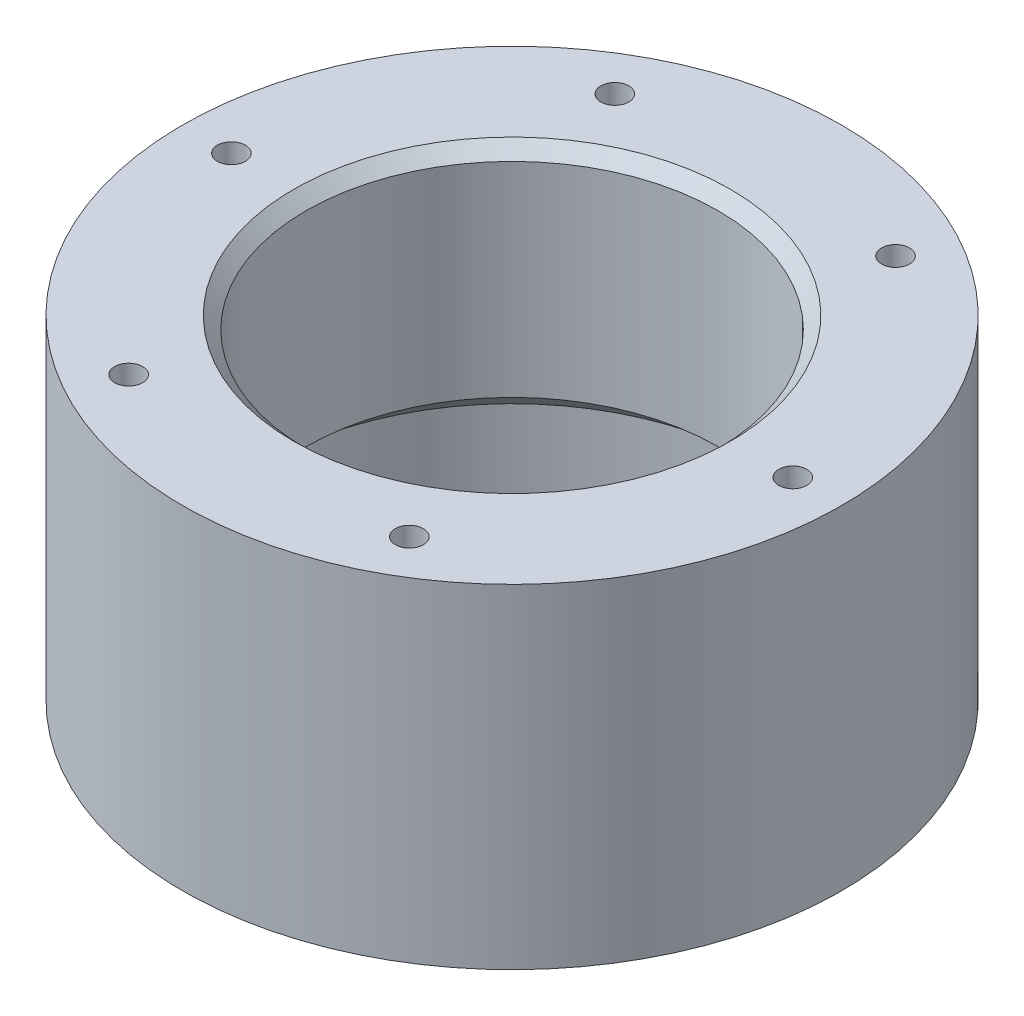
ISO-10303-21;
HEADER;
FILE_DESCRIPTION(('STEP AP214'),'2;1');
FILE_NAME('part.step','',(''),(''),'','','');
FILE_SCHEMA(('AUTOMOTIVE_DESIGN { 1 0 10303 214 1 1 1 1 }'));
ENDSEC;
DATA;
#1=APPLICATION_CONTEXT('core data for automotive mechanical design processes');
#2=APPLICATION_PROTOCOL_DEFINITION('international standard','automotive_design',2000,#1);
#3=PRODUCT_CONTEXT('',#1,'mechanical');
#4=PRODUCT('Part','Part','',(#3));
#5=PRODUCT_RELATED_PRODUCT_CATEGORY('part','',(#4));
#6=PRODUCT_DEFINITION_FORMATION('','',#4);
#7=PRODUCT_DEFINITION_CONTEXT('part definition',#1,'design');
#8=PRODUCT_DEFINITION('design','',#6,#7);
#9=PRODUCT_DEFINITION_SHAPE('','',#8);
#10=(LENGTH_UNIT() NAMED_UNIT(*) SI_UNIT(.MILLI.,.METRE.));
#11=(NAMED_UNIT(*) PLANE_ANGLE_UNIT() SI_UNIT($,.RADIAN.));
#12=(NAMED_UNIT(*) SI_UNIT($,.STERADIAN.) SOLID_ANGLE_UNIT());
#13=UNCERTAINTY_MEASURE_WITH_UNIT(LENGTH_MEASURE(1.E-05),#10,'distance_accuracy_value','');
#14=(GEOMETRIC_REPRESENTATION_CONTEXT(3) GLOBAL_UNCERTAINTY_ASSIGNED_CONTEXT((#13)) GLOBAL_UNIT_ASSIGNED_CONTEXT((#10,
#11,#12)) REPRESENTATION_CONTEXT('',''));
#15=CARTESIAN_POINT('',(0.,0.,0.));
#16=DIRECTION('',(0.,0.,1.));
#17=DIRECTION('',(1.,0.,0.));
#18=AXIS2_PLACEMENT_3D('',#15,#16,#17);
#19=CARTESIAN_POINT('',(0.,0.,0.));
#20=DIRECTION('',(0.,-1.,0.));
#21=DIRECTION('',(0.,0.,-1.));
#22=AXIS2_PLACEMENT_3D('',#19,#20,#21);
#23=CYLINDRICAL_SURFACE('',#22,60.);
#24=CARTESIAN_POINT('',(0.,-4.52770419426052,0.));
#25=DIRECTION('',(0.,-1.,0.));
#26=DIRECTION('',(0.,0.,-1.));
#27=AXIS2_PLACEMENT_3D('',#24,#25,#26);
#28=CIRCLE('',#27,60.);
#29=CARTESIAN_POINT('',(0.,-4.52770419426052,-60.));
#30=VERTEX_POINT('',#29);
#31=EDGE_CURVE('E107',#30,#30,#28,.T.);
#32=ORIENTED_EDGE('',*,*,#31,.T.);
#33=EDGE_LOOP('',(#32));
#34=FACE_BOUND('',#33,.T.);
#35=CARTESIAN_POINT('',(0.,15.4722958057395,0.));
#36=DIRECTION('',(0.,-1.,0.));
#37=DIRECTION('',(0.,0.,-1.));
#38=AXIS2_PLACEMENT_3D('',#35,#36,#37);
#39=CIRCLE('',#38,60.);
#40=CARTESIAN_POINT('',(0.,15.4722958057395,-60.));
#41=VERTEX_POINT('',#40);
#42=EDGE_CURVE('E11',#41,#41,#39,.T.);
#43=ORIENTED_EDGE('',*,*,#42,.F.);
#44=EDGE_LOOP('',(#43));
#45=FACE_BOUND('',#44,.T.);
#46=ADVANCED_FACE('F36',(#34,#45),#23,.F.);
#47=CARTESIAN_POINT('',(0.,15.4722958057395,0.));
#48=DIRECTION('',(0.,-1.,0.));
#49=DIRECTION('',(0.,0.,-1.));
#50=AXIS2_PLACEMENT_3D('',#47,#48,#49);
#51=CONICAL_SURFACE('',#50,60.,0.872664625997163);
#52=CARTESIAN_POINT('',(0.,23.8632921175124,0.));
#53=DIRECTION('',(0.,-1.,0.));
#54=DIRECTION('',(0.,0.,-1.));
#55=AXIS2_PLACEMENT_3D('',#52,#53,#54);
#56=CIRCLE('',#55,50.);
#57=CARTESIAN_POINT('',(0.,23.8632921175124,-50.));
#58=VERTEX_POINT('',#57);
#59=EDGE_CURVE('E43',#58,#58,#56,.T.);
#60=ORIENTED_EDGE('',*,*,#59,.F.);
#61=EDGE_LOOP('',(#60));
#62=FACE_BOUND('',#61,.T.);
#63=ORIENTED_EDGE('',*,*,#42,.T.);
#64=EDGE_LOOP('',(#63));
#65=FACE_BOUND('',#64,.T.);
#66=ADVANCED_FACE('F127',(#62,#65),#51,.F.);
#67=CARTESIAN_POINT('',(0.,0.,0.));
#68=DIRECTION('',(0.,-1.,0.));
#69=DIRECTION('',(0.,0.,-1.));
#70=AXIS2_PLACEMENT_3D('',#67,#68,#69);
#71=CYLINDRICAL_SURFACE('',#70,50.);
#72=ORIENTED_EDGE('',*,*,#59,.T.);
#73=EDGE_LOOP('',(#72));
#74=FACE_BOUND('',#73,.T.);
#75=CARTESIAN_POINT('',(0.,73.4722958057395,0.));
#76=DIRECTION('',(0.,-1.,0.));
#77=DIRECTION('',(0.,0.,-1.));
#78=AXIS2_PLACEMENT_3D('',#75,#76,#77);
#79=CIRCLE('',#78,50.);
#80=CARTESIAN_POINT('',(0.,73.4722958057395,-50.));
#81=VERTEX_POINT('',#80);
#82=EDGE_CURVE('E119',#81,#81,#79,.T.);
#83=ORIENTED_EDGE('',*,*,#82,.F.);
#84=EDGE_LOOP('',(#83));
#85=FACE_BOUND('',#84,.T.);
#86=ADVANCED_FACE('F124',(#74,#85),#71,.F.);
#87=CARTESIAN_POINT('',(0.,73.4722958057395,0.));
#88=DIRECTION('',(0.,1.,0.));
#89=DIRECTION('',(0.,0.,1.));
#90=AXIS2_PLACEMENT_3D('',#87,#88,#89);
#91=CONICAL_SURFACE('',#90,50.,0.785398163397448);
#92=CARTESIAN_POINT('',(0.,76.4722958057395,0.));
#93=DIRECTION('',(0.,-1.,0.));
#94=DIRECTION('',(0.,0.,-1.));
#95=AXIS2_PLACEMENT_3D('',#92,#93,#94);
#96=CIRCLE('',#95,53.);
#97=CARTESIAN_POINT('',(0.,76.4722958057395,-53.));
#98=VERTEX_POINT('',#97);
#99=EDGE_CURVE('E116',#98,#98,#96,.T.);
#100=ORIENTED_EDGE('',*,*,#99,.F.);
#101=EDGE_LOOP('',(#100));
#102=FACE_BOUND('',#101,.T.);
#103=ORIENTED_EDGE('',*,*,#82,.T.);
#104=EDGE_LOOP('',(#103));
#105=FACE_BOUND('',#104,.T.);
#106=ADVANCED_FACE('F154',(#102,#105),#91,.F.);
#107=CARTESIAN_POINT('',(0.,76.4722958057395,0.));
#108=DIRECTION('',(0.,-1.,0.));
#109=DIRECTION('',(0.,0.,-1.));
#110=AXIS2_PLACEMENT_3D('',#107,#108,#109);
#111=PLANE('',#110);
#112=CARTESIAN_POINT('',(-68.1367283340731,76.4722958057395,4.7579623093648E-13));
#113=DIRECTION('',(0.,1.,0.));
#114=DIRECTION('',(0.,0.,1.));
#115=AXIS2_PLACEMENT_3D('',#112,#113,#114);
#116=CIRCLE('',#115,3.4);
#117=CARTESIAN_POINT('',(-68.1367283340731,76.4722958057395,3.40000000000048));
#118=VERTEX_POINT('',#117);
#119=EDGE_CURVE('E73',#118,#118,#116,.T.);
#120=ORIENTED_EDGE('',*,*,#119,.F.);
#121=EDGE_LOOP('',(#120));
#122=FACE_BOUND('',#121,.T.);
#123=CARTESIAN_POINT('',(-34.0683641670368,76.4722958057395,-59.0081376680661));
#124=DIRECTION('',(0.,1.,0.));
#125=DIRECTION('',(0.,0.,1.));
#126=AXIS2_PLACEMENT_3D('',#123,#124,#125);
#127=CIRCLE('',#126,3.4);
#128=CARTESIAN_POINT('',(-34.0683641670368,76.4722958057395,-55.6081376680661));
#129=VERTEX_POINT('',#128);
#130=EDGE_CURVE('E72',#129,#129,#127,.T.);
#131=ORIENTED_EDGE('',*,*,#130,.F.);
#132=EDGE_LOOP('',(#131));
#133=FACE_BOUND('',#132,.T.);
#134=CARTESIAN_POINT('',(34.0683641670364,76.4722958057395,-59.0081376680663));
#135=DIRECTION('',(0.,1.,0.));
#136=DIRECTION('',(0.,0.,1.));
#137=AXIS2_PLACEMENT_3D('',#134,#135,#136);
#138=CIRCLE('',#137,3.4);
#139=CARTESIAN_POINT('',(34.0683641670364,76.4722958057395,-55.6081376680663));
#140=VERTEX_POINT('',#139);
#141=EDGE_CURVE('E83',#140,#140,#138,.T.);
#142=ORIENTED_EDGE('',*,*,#141,.F.);
#143=EDGE_LOOP('',(#142));
#144=FACE_BOUND('',#143,.T.);
#145=CARTESIAN_POINT('',(68.1367283340731,76.4722958057395,0.));
#146=DIRECTION('',(0.,1.,0.));
#147=DIRECTION('',(0.,0.,1.));
#148=AXIS2_PLACEMENT_3D('',#145,#146,#147);
#149=CIRCLE('',#148,3.4);
#150=CARTESIAN_POINT('',(68.1367283340731,76.4722958057395,3.4));
#151=VERTEX_POINT('',#150);
#152=EDGE_CURVE('E89',#151,#151,#149,.T.);
#153=ORIENTED_EDGE('',*,*,#152,.F.);
#154=EDGE_LOOP('',(#153));
#155=FACE_BOUND('',#154,.T.);
#156=CARTESIAN_POINT('',(34.0683641670372,76.4722958057395,59.0081376680658));
#157=DIRECTION('',(0.,1.,0.));
#158=DIRECTION('',(0.,0.,1.));
#159=AXIS2_PLACEMENT_3D('',#156,#157,#158);
#160=CIRCLE('',#159,3.4);
#161=CARTESIAN_POINT('',(34.0683641670372,76.4722958057395,62.4081376680658));
#162=VERTEX_POINT('',#161);
#163=EDGE_CURVE('E95',#162,#162,#160,.T.);
#164=ORIENTED_EDGE('',*,*,#163,.F.);
#165=EDGE_LOOP('',(#164));
#166=FACE_BOUND('',#165,.T.);
#167=CARTESIAN_POINT('',(-34.068364167036,76.4722958057395,59.0081376680665));
#168=DIRECTION('',(0.,1.,0.));
#169=DIRECTION('',(0.,0.,1.));
#170=AXIS2_PLACEMENT_3D('',#167,#168,#169);
#171=CIRCLE('',#170,3.4);
#172=CARTESIAN_POINT('',(-34.068364167036,76.4722958057395,62.4081376680665));
#173=VERTEX_POINT('',#172);
#174=EDGE_CURVE('E101',#173,#173,#171,.T.);
#175=ORIENTED_EDGE('',*,*,#174,.F.);
#176=EDGE_LOOP('',(#175));
#177=FACE_BOUND('',#176,.T.);
#178=CARTESIAN_POINT('',(0.,76.4722958057395,0.));
#179=DIRECTION('',(0.,-1.,0.));
#180=DIRECTION('',(0.,0.,-1.));
#181=AXIS2_PLACEMENT_3D('',#178,#179,#180);
#182=CIRCLE('',#181,80.);
#183=CARTESIAN_POINT('',(0.,76.4722958057395,-80.));
#184=VERTEX_POINT('',#183);
#185=EDGE_CURVE('E113',#184,#184,#182,.T.);
#186=ORIENTED_EDGE('',*,*,#185,.F.);
#187=EDGE_LOOP('',(#186));
#188=FACE_BOUND('',#187,.T.);
#189=ORIENTED_EDGE('',*,*,#99,.T.);
#190=EDGE_LOOP('',(#189));
#191=FACE_BOUND('',#190,.T.);
#192=ADVANCED_FACE('F148',(#122,#133,#144,#155,#166,#177,#188,#191),#111,.F.);
#193=CARTESIAN_POINT('',(0.,0.,0.));
#194=DIRECTION('',(0.,-1.,0.));
#195=DIRECTION('',(0.,0.,-1.));
#196=AXIS2_PLACEMENT_3D('',#193,#194,#195);
#197=CYLINDRICAL_SURFACE('',#196,80.);
#198=CARTESIAN_POINT('',(0.,-4.52770419426052,0.));
#199=DIRECTION('',(0.,-1.,0.));
#200=DIRECTION('',(0.,0.,-1.));
#201=AXIS2_PLACEMENT_3D('',#198,#199,#200);
#202=CIRCLE('',#201,80.);
#203=CARTESIAN_POINT('',(0.,-4.52770419426052,-80.));
#204=VERTEX_POINT('',#203);
#205=EDGE_CURVE('E110',#204,#204,#202,.T.);
#206=ORIENTED_EDGE('',*,*,#205,.F.);
#207=EDGE_LOOP('',(#206));
#208=FACE_BOUND('',#207,.T.);
#209=ORIENTED_EDGE('',*,*,#185,.T.);
#210=EDGE_LOOP('',(#209));
#211=FACE_BOUND('',#210,.T.);
#212=ADVANCED_FACE('F142',(#208,#211),#197,.T.);
#213=CARTESIAN_POINT('',(0.,-4.52770419426052,0.));
#214=DIRECTION('',(0.,1.,0.));
#215=DIRECTION('',(0.,0.,1.));
#216=AXIS2_PLACEMENT_3D('',#213,#214,#215);
#217=PLANE('',#216);
#218=ORIENTED_EDGE('',*,*,#31,.F.);
#219=EDGE_LOOP('',(#218));
#220=FACE_BOUND('',#219,.T.);
#221=ORIENTED_EDGE('',*,*,#205,.T.);
#222=EDGE_LOOP('',(#221));
#223=FACE_BOUND('',#222,.T.);
#224=ADVANCED_FACE('F138',(#220,#223),#217,.F.);
#225=CARTESIAN_POINT('',(-34.068364167036,36.4722958057395,59.0081376680665));
#226=DIRECTION('',(0.,1.,0.));
#227=DIRECTION('',(0.,0.,1.));
#228=AXIS2_PLACEMENT_3D('',#225,#226,#227);
#229=CONICAL_SURFACE('',#228,3.39999999999999,1.02974425867665);
#230=CARTESIAN_POINT('',(-34.068364167036,34.4293697010458,59.0081376680665));
#231=VERTEX_POINT('',#230);
#232=VERTEX_LOOP('',#231);
#233=FACE_BOUND('',#232,.T.);
#234=CARTESIAN_POINT('',(-34.068364167036,36.4722958057395,59.0081376680665));
#235=DIRECTION('',(0.,1.,0.));
#236=DIRECTION('',(0.,0.,1.));
#237=AXIS2_PLACEMENT_3D('',#234,#235,#236);
#238=CIRCLE('',#237,3.39999999999999);
#239=CARTESIAN_POINT('',(-34.068364167036,36.4722958057395,62.4081376680665));
#240=VERTEX_POINT('',#239);
#241=EDGE_CURVE('E104',#240,#240,#238,.T.);
#242=ORIENTED_EDGE('',*,*,#241,.T.);
#243=EDGE_LOOP('',(#242));
#244=FACE_BOUND('',#243,.T.);
#245=ADVANCED_FACE('F141',(#233,#244),#229,.F.);
#246=CARTESIAN_POINT('',(-34.068364167036,76.4722958057395,59.0081376680665));
#247=DIRECTION('',(0.,1.,0.));
#248=DIRECTION('',(0.,0.,1.));
#249=AXIS2_PLACEMENT_3D('',#246,#247,#248);
#250=CYLINDRICAL_SURFACE('',#249,3.4);
#251=ORIENTED_EDGE('',*,*,#241,.F.);
#252=EDGE_LOOP('',(#251));
#253=FACE_BOUND('',#252,.T.);
#254=ORIENTED_EDGE('',*,*,#174,.T.);
#255=EDGE_LOOP('',(#254));
#256=FACE_BOUND('',#255,.T.);
#257=ADVANCED_FACE('F170',(#253,#256),#250,.F.);
#258=CARTESIAN_POINT('',(34.0683641670372,36.4722958057395,59.0081376680658));
#259=DIRECTION('',(0.,1.,0.));
#260=DIRECTION('',(0.,0.,1.));
#261=AXIS2_PLACEMENT_3D('',#258,#259,#260);
#262=CONICAL_SURFACE('',#261,3.39999999999999,1.02974425867665);
#263=CARTESIAN_POINT('',(34.0683641670372,34.4293697010458,59.0081376680658));
#264=VERTEX_POINT('',#263);
#265=VERTEX_LOOP('',#264);
#266=FACE_BOUND('',#265,.T.);
#267=CARTESIAN_POINT('',(34.0683641670372,36.4722958057395,59.0081376680658));
#268=DIRECTION('',(0.,1.,0.));
#269=DIRECTION('',(0.,0.,1.));
#270=AXIS2_PLACEMENT_3D('',#267,#268,#269);
#271=CIRCLE('',#270,3.39999999999999);
#272=CARTESIAN_POINT('',(34.0683641670372,36.4722958057395,62.4081376680658));
#273=VERTEX_POINT('',#272);
#274=EDGE_CURVE('E98',#273,#273,#271,.T.);
#275=ORIENTED_EDGE('',*,*,#274,.T.);
#276=EDGE_LOOP('',(#275));
#277=FACE_BOUND('',#276,.T.);
#278=ADVANCED_FACE('F173',(#266,#277),#262,.F.);
#279=CARTESIAN_POINT('',(34.0683641670372,76.4722958057395,59.0081376680658));
#280=DIRECTION('',(0.,1.,0.));
#281=DIRECTION('',(0.,0.,1.));
#282=AXIS2_PLACEMENT_3D('',#279,#280,#281);
#283=CYLINDRICAL_SURFACE('',#282,3.4);
#284=ORIENTED_EDGE('',*,*,#274,.F.);
#285=EDGE_LOOP('',(#284));
#286=FACE_BOUND('',#285,.T.);
#287=ORIENTED_EDGE('',*,*,#163,.T.);
#288=EDGE_LOOP('',(#287));
#289=FACE_BOUND('',#288,.T.);
#290=ADVANCED_FACE('F177',(#286,#289),#283,.F.);
#291=CARTESIAN_POINT('',(68.1367283340731,36.4722958057395,0.));
#292=DIRECTION('',(0.,1.,0.));
#293=DIRECTION('',(0.,0.,1.));
#294=AXIS2_PLACEMENT_3D('',#291,#292,#293);
#295=CONICAL_SURFACE('',#294,3.39999999999999,1.02974425867665);
#296=CARTESIAN_POINT('',(68.136728334073,34.4293697010458,0.));
#297=VERTEX_POINT('',#296);
#298=VERTEX_LOOP('',#297);
#299=FACE_BOUND('',#298,.T.);
#300=CARTESIAN_POINT('',(68.1367283340731,36.4722958057395,0.));
#301=DIRECTION('',(0.,1.,0.));
#302=DIRECTION('',(0.,0.,1.));
#303=AXIS2_PLACEMENT_3D('',#300,#301,#302);
#304=CIRCLE('',#303,3.39999999999999);
#305=CARTESIAN_POINT('',(68.1367283340731,36.4722958057395,3.39999999999999));
#306=VERTEX_POINT('',#305);
#307=EDGE_CURVE('E92',#306,#306,#304,.T.);
#308=ORIENTED_EDGE('',*,*,#307,.T.);
#309=EDGE_LOOP('',(#308));
#310=FACE_BOUND('',#309,.T.);
#311=ADVANCED_FACE('F180',(#299,#310),#295,.F.);
#312=CARTESIAN_POINT('',(68.1367283340731,76.4722958057395,0.));
#313=DIRECTION('',(0.,1.,0.));
#314=DIRECTION('',(0.,0.,1.));
#315=AXIS2_PLACEMENT_3D('',#312,#313,#314);
#316=CYLINDRICAL_SURFACE('',#315,3.39999999999999);
#317=ORIENTED_EDGE('',*,*,#307,.F.);
#318=EDGE_LOOP('',(#317));
#319=FACE_BOUND('',#318,.T.);
#320=ORIENTED_EDGE('',*,*,#152,.T.);
#321=EDGE_LOOP('',(#320));
#322=FACE_BOUND('',#321,.T.);
#323=ADVANCED_FACE('F184',(#319,#322),#316,.F.);
#324=CARTESIAN_POINT('',(34.0683641670364,36.4722958057395,-59.0081376680663));
#325=DIRECTION('',(0.,1.,0.));
#326=DIRECTION('',(0.,0.,1.));
#327=AXIS2_PLACEMENT_3D('',#324,#325,#326);
#328=CONICAL_SURFACE('',#327,3.39999999999999,1.02974425867665);
#329=CARTESIAN_POINT('',(34.0683641670364,34.4293697010458,-59.0081376680663));
#330=VERTEX_POINT('',#329);
#331=VERTEX_LOOP('',#330);
#332=FACE_BOUND('',#331,.T.);
#333=CARTESIAN_POINT('',(34.0683641670364,36.4722958057395,-59.0081376680663));
#334=DIRECTION('',(0.,1.,0.));
#335=DIRECTION('',(0.,0.,1.));
#336=AXIS2_PLACEMENT_3D('',#333,#334,#335);
#337=CIRCLE('',#336,3.39999999999999);
#338=CARTESIAN_POINT('',(34.0683641670364,36.4722958057395,-55.6081376680663));
#339=VERTEX_POINT('',#338);
#340=EDGE_CURVE('E86',#339,#339,#337,.T.);
#341=ORIENTED_EDGE('',*,*,#340,.T.);
#342=EDGE_LOOP('',(#341));
#343=FACE_BOUND('',#342,.T.);
#344=ADVANCED_FACE('F188',(#332,#343),#328,.F.);
#345=CARTESIAN_POINT('',(34.0683641670364,76.4722958057395,-59.0081376680663));
#346=DIRECTION('',(0.,1.,0.));
#347=DIRECTION('',(0.,0.,1.));
#348=AXIS2_PLACEMENT_3D('',#345,#346,#347);
#349=CYLINDRICAL_SURFACE('',#348,3.4);
#350=ORIENTED_EDGE('',*,*,#340,.F.);
#351=EDGE_LOOP('',(#350));
#352=FACE_BOUND('',#351,.T.);
#353=ORIENTED_EDGE('',*,*,#141,.T.);
#354=EDGE_LOOP('',(#353));
#355=FACE_BOUND('',#354,.T.);
#356=ADVANCED_FACE('F192',(#352,#355),#349,.F.);
#357=CARTESIAN_POINT('',(-34.0683641670368,36.4722958057395,-59.0081376680661));
#358=DIRECTION('',(0.,1.,0.));
#359=DIRECTION('',(0.,0.,1.));
#360=AXIS2_PLACEMENT_3D('',#357,#358,#359);
#361=CONICAL_SURFACE('',#360,3.39999999999999,1.02974425867665);
#362=CARTESIAN_POINT('',(-34.0683641670368,34.4293697010458,-59.0081376680661));
#363=VERTEX_POINT('',#362);
#364=VERTEX_LOOP('',#363);
#365=FACE_BOUND('',#364,.T.);
#366=CARTESIAN_POINT('',(-34.0683641670368,36.4722958057395,-59.0081376680661));
#367=DIRECTION('',(0.,1.,0.));
#368=DIRECTION('',(0.,0.,1.));
#369=AXIS2_PLACEMENT_3D('',#366,#367,#368);
#370=CIRCLE('',#369,3.39999999999999);
#371=CARTESIAN_POINT('',(-34.0683641670368,36.4722958057395,-55.6081376680661));
#372=VERTEX_POINT('',#371);
#373=EDGE_CURVE('E76',#372,#372,#370,.T.);
#374=ORIENTED_EDGE('',*,*,#373,.T.);
#375=EDGE_LOOP('',(#374));
#376=FACE_BOUND('',#375,.T.);
#377=ADVANCED_FACE('F196',(#365,#376),#361,.F.);
#378=CARTESIAN_POINT('',(-34.0683641670368,76.4722958057395,-59.0081376680661));
#379=DIRECTION('',(0.,1.,0.));
#380=DIRECTION('',(0.,0.,1.));
#381=AXIS2_PLACEMENT_3D('',#378,#379,#380);
#382=CYLINDRICAL_SURFACE('',#381,3.4);
#383=ORIENTED_EDGE('',*,*,#373,.F.);
#384=EDGE_LOOP('',(#383));
#385=FACE_BOUND('',#384,.T.);
#386=ORIENTED_EDGE('',*,*,#130,.T.);
#387=EDGE_LOOP('',(#386));
#388=FACE_BOUND('',#387,.T.);
#389=ADVANCED_FACE('F66',(#385,#388),#382,.F.);
#390=CARTESIAN_POINT('',(-68.1367283340731,36.4722958057395,4.7579623093648E-13));
#391=DIRECTION('',(0.,1.,0.));
#392=DIRECTION('',(0.,0.,1.));
#393=AXIS2_PLACEMENT_3D('',#390,#391,#392);
#394=CONICAL_SURFACE('',#393,3.39999999999999,1.02974425867665);
#395=CARTESIAN_POINT('',(-68.1367283340731,34.4293697010458,4.7579623093648E-13));
#396=VERTEX_POINT('',#395);
#397=VERTEX_LOOP('',#396);
#398=FACE_BOUND('',#397,.T.);
#399=CARTESIAN_POINT('',(-68.1367283340731,36.4722958057395,4.7579623093648E-13));
#400=DIRECTION('',(0.,1.,0.));
#401=DIRECTION('',(0.,0.,1.));
#402=AXIS2_PLACEMENT_3D('',#399,#400,#401);
#403=CIRCLE('',#402,3.39999999999999);
#404=CARTESIAN_POINT('',(-68.1367283340731,36.4722958057395,3.40000000000046));
#405=VERTEX_POINT('',#404);
#406=EDGE_CURVE('E70',#405,#405,#403,.T.);
#407=ORIENTED_EDGE('',*,*,#406,.T.);
#408=EDGE_LOOP('',(#407));
#409=FACE_BOUND('',#408,.T.);
#410=ADVANCED_FACE('F62',(#398,#409),#394,.F.);
#411=CARTESIAN_POINT('',(-68.1367283340731,76.4722958057395,4.7579623093648E-13));
#412=DIRECTION('',(0.,1.,0.));
#413=DIRECTION('',(0.,0.,1.));
#414=AXIS2_PLACEMENT_3D('',#411,#412,#413);
#415=CYLINDRICAL_SURFACE('',#414,3.39999999999999);
#416=ORIENTED_EDGE('',*,*,#406,.F.);
#417=EDGE_LOOP('',(#416));
#418=FACE_BOUND('',#417,.T.);
#419=ORIENTED_EDGE('',*,*,#119,.T.);
#420=EDGE_LOOP('',(#419));
#421=FACE_BOUND('',#420,.T.);
#422=ADVANCED_FACE('F65',(#418,#421),#415,.F.);
#423=CLOSED_SHELL('',(#46,#66,#86,#106,#192,#212,#224,#245,#257,#278,#290,#311,#323,#344,#356,
#377,#389,#410,#422));
#424=MANIFOLD_SOLID_BREP('B2',#423);
#425=ADVANCED_BREP_SHAPE_REPRESENTATION('',(#18,#424),#14);
#426=SHAPE_DEFINITION_REPRESENTATION(#9,#425);
ENDSEC;
END-ISO-10303-21;
